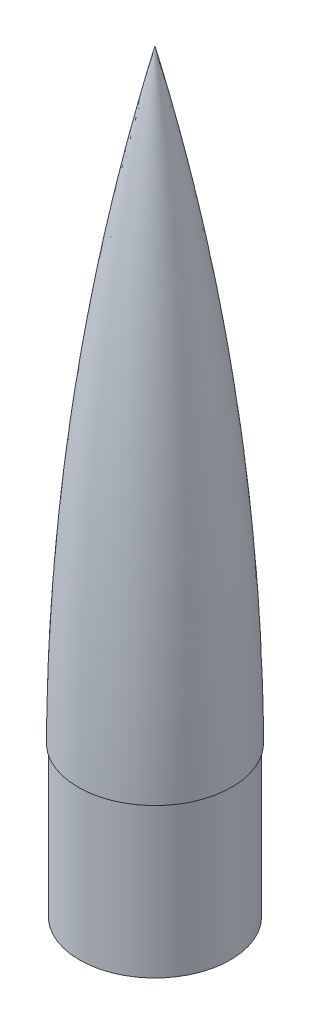
ISO-10303-21;
HEADER;
FILE_DESCRIPTION(('STEP AP214'),'2;1');
FILE_NAME('part.step','',(''),(''),'','','');
FILE_SCHEMA(('AUTOMOTIVE_DESIGN { 1 0 10303 214 1 1 1 1 }'));
ENDSEC;
DATA;
#1=APPLICATION_CONTEXT('core data for automotive mechanical design processes');
#2=APPLICATION_PROTOCOL_DEFINITION('international standard','automotive_design',2000,#1);
#3=PRODUCT_CONTEXT('',#1,'mechanical');
#4=PRODUCT('Part','Part','',(#3));
#5=PRODUCT_RELATED_PRODUCT_CATEGORY('part','',(#4));
#6=PRODUCT_DEFINITION_FORMATION('','',#4);
#7=PRODUCT_DEFINITION_CONTEXT('part definition',#1,'design');
#8=PRODUCT_DEFINITION('design','',#6,#7);
#9=PRODUCT_DEFINITION_SHAPE('','',#8);
#10=(LENGTH_UNIT() NAMED_UNIT(*) SI_UNIT(.MILLI.,.METRE.));
#11=(NAMED_UNIT(*) PLANE_ANGLE_UNIT() SI_UNIT($,.RADIAN.));
#12=(NAMED_UNIT(*) SI_UNIT($,.STERADIAN.) SOLID_ANGLE_UNIT());
#13=UNCERTAINTY_MEASURE_WITH_UNIT(LENGTH_MEASURE(1.E-05),#10,'distance_accuracy_value','');
#14=(GEOMETRIC_REPRESENTATION_CONTEXT(3) GLOBAL_UNCERTAINTY_ASSIGNED_CONTEXT((#13)) GLOBAL_UNIT_ASSIGNED_CONTEXT((#10,
#11,#12)) REPRESENTATION_CONTEXT('',''));
#15=CARTESIAN_POINT('',(0.,0.,0.));
#16=DIRECTION('',(0.,0.,1.));
#17=DIRECTION('',(1.,0.,0.));
#18=AXIS2_PLACEMENT_3D('',#15,#16,#17);
#19=CARTESIAN_POINT('',(0.,147.506787476945,-2471.31225785189));
#20=DIRECTION('',(-1.,0.,0.));
#21=DIRECTION('',(0.,0.,1.));
#22=AXIS2_PLACEMENT_3D('',#19,#20,#21);
#23=CIRCLE('',#22,2546.096);
#24=TRIMMED_CURVE('',#23,(PARAMETER_VALUE(-0.242968506155099)),
(PARAMETER_VALUE(0.242968506155099)),.T.,.PARAMETER.);
#25=CARTESIAN_POINT('',(0.,147.506787476945,0.));
#26=DIRECTION('',(0.,1.,0.));
#27=AXIS1_PLACEMENT('',#25,#26);
#28=SURFACE_OF_REVOLUTION('',#24,#27);
#29=CARTESIAN_POINT('',(0.,760.0592876,0.));
#30=VERTEX_POINT('',#29);
#31=VERTEX_LOOP('',#30);
#32=FACE_BOUND('',#31,.T.);
#33=CARTESIAN_POINT('',(0.,151.8793,0.));
#34=DIRECTION('',(0.,1.,0.));
#35=DIRECTION('',(0.,0.,1.));
#36=AXIS2_PLACEMENT_3D('',#33,#34,#35);
#37=CIRCLE('',#36,74.7799876);
#38=CARTESIAN_POINT('',(0.,151.8793,74.7799876));
#39=VERTEX_POINT('',#38);
#40=EDGE_CURVE('E11',#39,#39,#37,.T.);
#41=ORIENTED_EDGE('',*,*,#40,.F.);
#42=EDGE_LOOP('',(#41));
#43=FACE_BOUND('',#42,.T.);
#44=ADVANCED_FACE('F41',(#32,#43),#28,.F.);
#45=CARTESIAN_POINT('',(0.,161.723937121431,0.));
#46=DIRECTION('',(0.,1.,0.));
#47=DIRECTION('',(0.,0.,1.));
#48=AXIS2_PLACEMENT_3D('',#45,#46,#47);
#49=CYLINDRICAL_SURFACE('',#48,74.7799876);
#50=ORIENTED_EDGE('',*,*,#40,.T.);
#51=EDGE_LOOP('',(#50));
#52=FACE_BOUND('',#51,.T.);
#53=CARTESIAN_POINT('',(0.,0.,0.));
#54=DIRECTION('',(0.,1.,0.));
#55=DIRECTION('',(0.,0.,1.));
#56=AXIS2_PLACEMENT_3D('',#53,#54,#55);
#57=CIRCLE('',#56,74.7799876);
#58=CARTESIAN_POINT('',(0.,0.,74.7799876));
#59=VERTEX_POINT('',#58);
#60=EDGE_CURVE('E48',#59,#59,#57,.T.);
#61=ORIENTED_EDGE('',*,*,#60,.F.);
#62=EDGE_LOOP('',(#61));
#63=FACE_BOUND('',#62,.T.);
#64=ADVANCED_FACE('F75',(#52,#63),#49,.F.);
#65=CARTESIAN_POINT('',(0.,0.,0.));
#66=DIRECTION('',(0.,1.,0.));
#67=DIRECTION('',(0.,0.,1.));
#68=AXIS2_PLACEMENT_3D('',#65,#66,#67);
#69=PLANE('',#68);
#70=CARTESIAN_POINT('',(0.,0.,0.));
#71=DIRECTION('',(0.,1.,0.));
#72=DIRECTION('',(0.,0.,1.));
#73=AXIS2_PLACEMENT_3D('',#70,#71,#72);
#74=CIRCLE('',#73,76.2);
#75=CARTESIAN_POINT('',(0.,0.,76.2));
#76=VERTEX_POINT('',#75);
#77=EDGE_CURVE('E66',#76,#76,#74,.T.);
#78=ORIENTED_EDGE('',*,*,#77,.F.);
#79=EDGE_LOOP('',(#78));
#80=FACE_BOUND('',#79,.T.);
#81=ORIENTED_EDGE('',*,*,#60,.T.);
#82=EDGE_LOOP('',(#81));
#83=FACE_BOUND('',#82,.T.);
#84=ADVANCED_FACE('F73',(#80,#83),#69,.F.);
#85=CARTESIAN_POINT('',(0.,161.723937121431,0.));
#86=DIRECTION('',(0.,1.,0.));
#87=DIRECTION('',(0.,0.,1.));
#88=AXIS2_PLACEMENT_3D('',#85,#86,#87);
#89=CYLINDRICAL_SURFACE('',#88,76.2);
#90=CARTESIAN_POINT('',(0.,151.8793,0.));
#91=DIRECTION('',(0.,1.,0.));
#92=DIRECTION('',(0.,0.,1.));
#93=AXIS2_PLACEMENT_3D('',#90,#91,#92);
#94=CIRCLE('',#93,76.2);
#95=CARTESIAN_POINT('',(0.,151.8793,76.2));
#96=VERTEX_POINT('',#95);
#97=EDGE_CURVE('E63',#96,#96,#94,.T.);
#98=ORIENTED_EDGE('',*,*,#97,.F.);
#99=EDGE_LOOP('',(#98));
#100=FACE_BOUND('',#99,.T.);
#101=ORIENTED_EDGE('',*,*,#77,.T.);
#102=EDGE_LOOP('',(#101));
#103=FACE_BOUND('',#102,.T.);
#104=ADVANCED_FACE('F82',(#100,#103),#89,.T.);
#105=CARTESIAN_POINT('',(0.,151.8793,0.));
#106=DIRECTION('',(0.,1.,0.));
#107=DIRECTION('',(0.,0.,1.));
#108=AXIS2_PLACEMENT_3D('',#105,#106,#107);
#109=PLANE('',#108);
#110=CARTESIAN_POINT('',(0.,151.8793,0.));
#111=DIRECTION('',(0.,1.,0.));
#112=DIRECTION('',(0.,0.,1.));
#113=AXIS2_PLACEMENT_3D('',#110,#111,#112);
#114=CIRCLE('',#113,77.6200124);
#115=CARTESIAN_POINT('',(0.,151.8793,77.6200124));
#116=VERTEX_POINT('',#115);
#117=EDGE_CURVE('E61',#116,#116,#114,.T.);
#118=ORIENTED_EDGE('',*,*,#117,.F.);
#119=EDGE_LOOP('',(#118));
#120=FACE_BOUND('',#119,.T.);
#121=ORIENTED_EDGE('',*,*,#97,.T.);
#122=EDGE_LOOP('',(#121));
#123=FACE_BOUND('',#122,.T.);
#124=ADVANCED_FACE('F57',(#120,#123),#109,.F.);
#125=CARTESIAN_POINT('',(0.,137.442950904214,-2468.35885903959));
#126=DIRECTION('',(-1.,0.,0.));
#127=DIRECTION('',(0.,0.,1.));
#128=AXIS2_PLACEMENT_3D('',#125,#126,#127);
#129=CIRCLE('',#128,2546.0198);
#130=TRIMMED_CURVE('',#129,(PARAMETER_VALUE(-0.247625631179462)),
(PARAMETER_VALUE(0.247625631179462)),.T.,.PARAMETER.);
#131=CARTESIAN_POINT('',(0.,137.442950904214,0.));
#132=DIRECTION('',(0.,1.,0.));
#133=AXIS1_PLACEMENT('',#131,#132);
#134=SURFACE_OF_REVOLUTION('',#130,#133);
#135=CARTESIAN_POINT('',(0.,761.4793,0.));
#136=VERTEX_POINT('',#135);
#137=VERTEX_LOOP('',#136);
#138=FACE_BOUND('',#137,.T.);
#139=ORIENTED_EDGE('',*,*,#117,.T.);
#140=EDGE_LOOP('',(#139));
#141=FACE_BOUND('',#140,.T.);
#142=ADVANCED_FACE('F54',(#138,#141),#134,.T.);
#143=CLOSED_SHELL('',(#44,#64,#84,#104,#124,#142));
#144=MANIFOLD_SOLID_BREP('B2',#143);
#145=ADVANCED_BREP_SHAPE_REPRESENTATION('',(#18,#144),#14);
#146=SHAPE_DEFINITION_REPRESENTATION(#9,#145);
ENDSEC;
END-ISO-10303-21;
